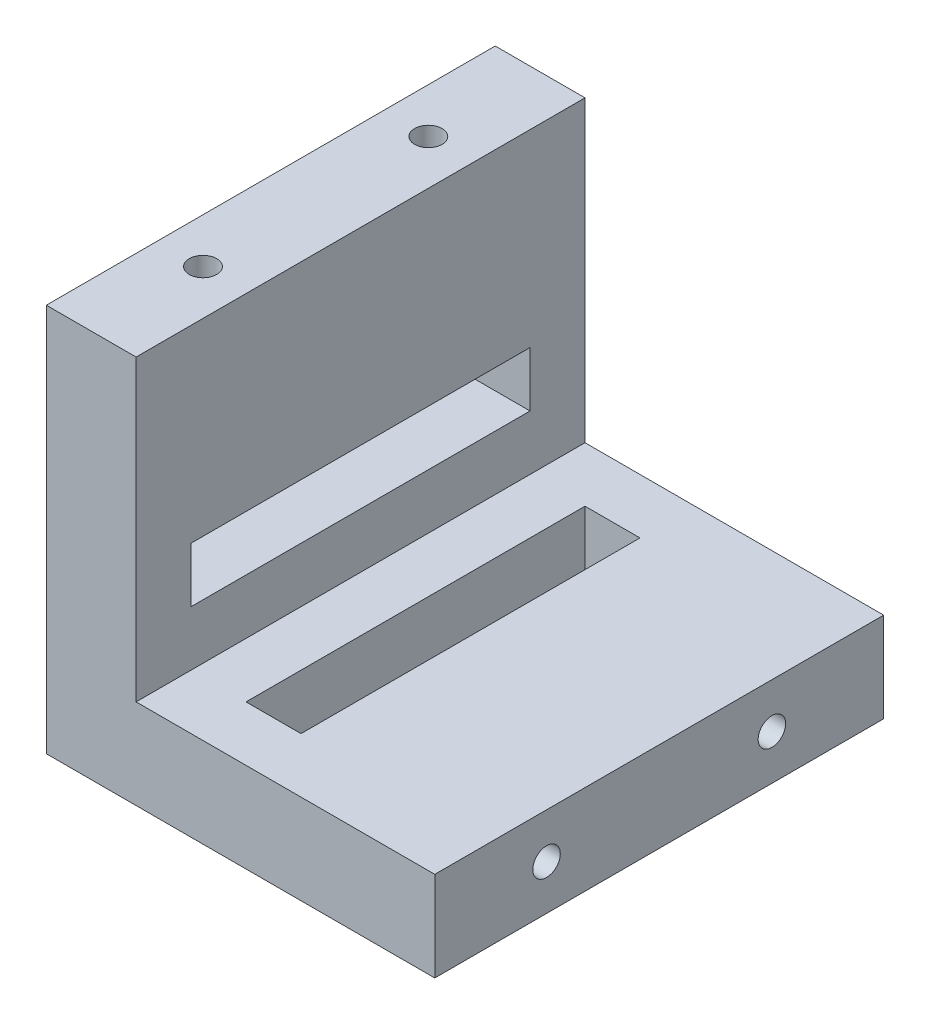
ISO-10303-21;
HEADER;
FILE_DESCRIPTION(('STEP AP214'),'2;1');
FILE_NAME('part.step','',(''),(''),'','','');
FILE_SCHEMA(('AUTOMOTIVE_DESIGN { 1 0 10303 214 1 1 1 1 }'));
ENDSEC;
DATA;
#1=APPLICATION_CONTEXT('core data for automotive mechanical design processes');
#2=APPLICATION_PROTOCOL_DEFINITION('international standard','automotive_design',2000,#1);
#3=PRODUCT_CONTEXT('',#1,'mechanical');
#4=PRODUCT('Part','Part','',(#3));
#5=PRODUCT_RELATED_PRODUCT_CATEGORY('part','',(#4));
#6=PRODUCT_DEFINITION_FORMATION('','',#4);
#7=PRODUCT_DEFINITION_CONTEXT('part definition',#1,'design');
#8=PRODUCT_DEFINITION('design','',#6,#7);
#9=PRODUCT_DEFINITION_SHAPE('','',#8);
#10=(LENGTH_UNIT() NAMED_UNIT(*) SI_UNIT(.MILLI.,.METRE.));
#11=(NAMED_UNIT(*) PLANE_ANGLE_UNIT() SI_UNIT($,.RADIAN.));
#12=(NAMED_UNIT(*) SI_UNIT($,.STERADIAN.) SOLID_ANGLE_UNIT());
#13=UNCERTAINTY_MEASURE_WITH_UNIT(LENGTH_MEASURE(1.E-05),#10,'distance_accuracy_value','');
#14=(GEOMETRIC_REPRESENTATION_CONTEXT(3) GLOBAL_UNCERTAINTY_ASSIGNED_CONTEXT((#13)) GLOBAL_UNIT_ASSIGNED_CONTEXT((#10,
#11,#12)) REPRESENTATION_CONTEXT('',''));
#15=CARTESIAN_POINT('',(0.,0.,0.));
#16=DIRECTION('',(0.,0.,1.));
#17=DIRECTION('',(1.,0.,0.));
#18=AXIS2_PLACEMENT_3D('',#15,#16,#17);
#19=CARTESIAN_POINT('',(21.2,0.,24.5));
#20=DIRECTION('',(0.,1.,0.));
#21=DIRECTION('',(-1.,0.,0.));
#22=AXIS2_PLACEMENT_3D('',#19,#20,#21);
#23=PLANE('',#22);
#24=DIRECTION('',(1.,0.,0.));
#25=VECTOR('',#24,1.);
#26=CARTESIAN_POINT('',(21.2,0.,21.5));
#27=LINE('',#26,#25);
#28=CARTESIAN_POINT('',(7.9,0.,21.5));
#29=VERTEX_POINT('',#28);
#30=CARTESIAN_POINT('',(10.9,0.,21.5));
#31=VERTEX_POINT('',#30);
#32=EDGE_CURVE('E186',#29,#31,#27,.T.);
#33=ORIENTED_EDGE('',*,*,#32,.T.);
#34=DIRECTION('',(0.,0.,-1.));
#35=VECTOR('',#34,1.);
#36=CARTESIAN_POINT('',(10.9,0.,24.5));
#37=LINE('',#36,#35);
#38=CARTESIAN_POINT('',(10.9,0.,3.));
#39=VERTEX_POINT('',#38);
#40=EDGE_CURVE('E189',#31,#39,#37,.T.);
#41=ORIENTED_EDGE('',*,*,#40,.T.);
#42=DIRECTION('',(-1.,0.,0.));
#43=VECTOR('',#42,1.);
#44=CARTESIAN_POINT('',(21.2,0.,3.));
#45=LINE('',#44,#43);
#46=CARTESIAN_POINT('',(7.9,0.,3.));
#47=VERTEX_POINT('',#46);
#48=EDGE_CURVE('E174',#39,#47,#45,.T.);
#49=ORIENTED_EDGE('',*,*,#48,.T.);
#50=DIRECTION('',(0.,0.,1.));
#51=VECTOR('',#50,1.);
#52=CARTESIAN_POINT('',(7.9,0.,24.5));
#53=LINE('',#52,#51);
#54=EDGE_CURVE('E183',#47,#29,#53,.T.);
#55=ORIENTED_EDGE('',*,*,#54,.T.);
#56=EDGE_LOOP('',(#33,#41,#49,#55));
#57=FACE_BOUND('',#56,.T.);
#58=DIRECTION('',(1.,0.,0.));
#59=VECTOR('',#58,1.);
#60=CARTESIAN_POINT('',(21.2,0.,0.));
#61=LINE('',#60,#59);
#62=CARTESIAN_POINT('',(0.,0.,0.));
#63=VERTEX_POINT('',#62);
#64=CARTESIAN_POINT('',(21.2,0.,0.));
#65=VERTEX_POINT('',#64);
#66=EDGE_CURVE('E214',#63,#65,#61,.T.);
#67=ORIENTED_EDGE('',*,*,#66,.T.);
#68=DIRECTION('',(0.,0.,-1.));
#69=VECTOR('',#68,1.);
#70=CARTESIAN_POINT('',(21.2,0.,24.5));
#71=LINE('',#70,#69);
#72=CARTESIAN_POINT('',(21.2,0.,24.5));
#73=VERTEX_POINT('',#72);
#74=EDGE_CURVE('E257',#73,#65,#71,.T.);
#75=ORIENTED_EDGE('',*,*,#74,.F.);
#76=DIRECTION('',(1.,0.,0.));
#77=VECTOR('',#76,1.);
#78=CARTESIAN_POINT('',(21.2,0.,24.5));
#79=LINE('',#78,#77);
#80=CARTESIAN_POINT('',(0.,0.,24.5));
#81=VERTEX_POINT('',#80);
#82=EDGE_CURVE('E217',#81,#73,#79,.T.);
#83=ORIENTED_EDGE('',*,*,#82,.F.);
#84=DIRECTION('',(0.,0.,-1.));
#85=VECTOR('',#84,1.);
#86=CARTESIAN_POINT('',(0.,0.,24.5));
#87=LINE('',#86,#85);
#88=EDGE_CURVE('E231',#81,#63,#87,.T.);
#89=ORIENTED_EDGE('',*,*,#88,.T.);
#90=EDGE_LOOP('',(#67,#75,#83,#89));
#91=FACE_BOUND('',#90,.T.);
#92=ADVANCED_FACE('F32',(#57,#91),#23,.F.);
#93=CARTESIAN_POINT('',(21.2,4.9,24.5));
#94=DIRECTION('',(-1.,0.,0.));
#95=DIRECTION('',(0.,-1.,0.));
#96=AXIS2_PLACEMENT_3D('',#93,#94,#95);
#97=PLANE('',#96);
#98=CARTESIAN_POINT('',(21.2,2.45,18.4));
#99=DIRECTION('',(1.,0.,0.));
#100=DIRECTION('',(0.,1.,0.));
#101=AXIS2_PLACEMENT_3D('',#98,#99,#100);
#102=CIRCLE('',#101,0.750000000000002);
#103=CARTESIAN_POINT('',(21.2,3.2,18.4));
#104=VERTEX_POINT('',#103);
#105=EDGE_CURVE('E202',#104,#104,#102,.T.);
#106=ORIENTED_EDGE('',*,*,#105,.F.);
#107=EDGE_LOOP('',(#106));
#108=FACE_BOUND('',#107,.T.);
#109=CARTESIAN_POINT('',(21.2,2.45,6.1));
#110=DIRECTION('',(1.,0.,0.));
#111=DIRECTION('',(0.,1.,0.));
#112=AXIS2_PLACEMENT_3D('',#109,#110,#111);
#113=CIRCLE('',#112,0.75);
#114=CARTESIAN_POINT('',(21.2,3.2,6.1));
#115=VERTEX_POINT('',#114);
#116=EDGE_CURVE('E208',#115,#115,#113,.T.);
#117=ORIENTED_EDGE('',*,*,#116,.F.);
#118=EDGE_LOOP('',(#117));
#119=FACE_BOUND('',#118,.T.);
#120=DIRECTION('',(0.,1.,0.));
#121=VECTOR('',#120,1.);
#122=CARTESIAN_POINT('',(21.2,4.9,0.));
#123=LINE('',#122,#121);
#124=CARTESIAN_POINT('',(21.2,4.9,0.));
#125=VERTEX_POINT('',#124);
#126=EDGE_CURVE('E234',#65,#125,#123,.T.);
#127=ORIENTED_EDGE('',*,*,#126,.T.);
#128=DIRECTION('',(0.,0.,-1.));
#129=VECTOR('',#128,1.);
#130=CARTESIAN_POINT('',(21.2,4.9,24.5));
#131=LINE('',#130,#129);
#132=CARTESIAN_POINT('',(21.2,4.9,24.5));
#133=VERTEX_POINT('',#132);
#134=EDGE_CURVE('E254',#133,#125,#131,.T.);
#135=ORIENTED_EDGE('',*,*,#134,.F.);
#136=DIRECTION('',(0.,1.,0.));
#137=VECTOR('',#136,1.);
#138=CARTESIAN_POINT('',(21.2,4.9,24.5));
#139=LINE('',#138,#137);
#140=EDGE_CURVE('E220',#73,#133,#139,.T.);
#141=ORIENTED_EDGE('',*,*,#140,.F.);
#142=ORIENTED_EDGE('',*,*,#74,.T.);
#143=EDGE_LOOP('',(#127,#135,#141,#142));
#144=FACE_BOUND('',#143,.T.);
#145=ADVANCED_FACE('F284',(#108,#119,#144),#97,.F.);
#146=CARTESIAN_POINT('',(4.9,4.90000000000001,24.5));
#147=DIRECTION('',(0.,-1.,0.));
#148=DIRECTION('',(1.,0.,0.));
#149=AXIS2_PLACEMENT_3D('',#146,#147,#148);
#150=PLANE('',#149);
#151=DIRECTION('',(-1.,0.,0.));
#152=VECTOR('',#151,1.);
#153=CARTESIAN_POINT('',(7.9,4.90000000000001,3.));
#154=LINE('',#153,#152);
#155=CARTESIAN_POINT('',(10.9,4.9,3.));
#156=VERTEX_POINT('',#155);
#157=CARTESIAN_POINT('',(7.9,4.90000000000001,3.));
#158=VERTEX_POINT('',#157);
#159=EDGE_CURVE('E162',#156,#158,#154,.T.);
#160=ORIENTED_EDGE('',*,*,#159,.F.);
#161=DIRECTION('',(0.,0.,-1.));
#162=VECTOR('',#161,1.);
#163=CARTESIAN_POINT('',(10.9,4.90000000000001,3.));
#164=LINE('',#163,#162);
#165=CARTESIAN_POINT('',(10.9,4.90000000000001,21.5));
#166=VERTEX_POINT('',#165);
#167=EDGE_CURVE('E158',#166,#156,#164,.T.);
#168=ORIENTED_EDGE('',*,*,#167,.F.);
#169=DIRECTION('',(1.,0.,0.));
#170=VECTOR('',#169,1.);
#171=CARTESIAN_POINT('',(7.9,4.90000000000001,21.5));
#172=LINE('',#171,#170);
#173=CARTESIAN_POINT('',(7.9,4.90000000000001,21.5));
#174=VERTEX_POINT('',#173);
#175=EDGE_CURVE('E168',#174,#166,#172,.T.);
#176=ORIENTED_EDGE('',*,*,#175,.F.);
#177=DIRECTION('',(0.,0.,1.));
#178=VECTOR('',#177,1.);
#179=CARTESIAN_POINT('',(7.9,4.90000000000001,3.));
#180=LINE('',#179,#178);
#181=EDGE_CURVE('E165',#158,#174,#180,.T.);
#182=ORIENTED_EDGE('',*,*,#181,.F.);
#183=EDGE_LOOP('',(#160,#168,#176,#182));
#184=FACE_BOUND('',#183,.T.);
#185=DIRECTION('',(-1.,0.,0.));
#186=VECTOR('',#185,1.);
#187=CARTESIAN_POINT('',(4.9,4.90000000000001,0.));
#188=LINE('',#187,#186);
#189=CARTESIAN_POINT('',(4.9,4.90000000000001,0.));
#190=VERTEX_POINT('',#189);
#191=EDGE_CURVE('E236',#125,#190,#188,.T.);
#192=ORIENTED_EDGE('',*,*,#191,.T.);
#193=DIRECTION('',(0.,0.,-1.));
#194=VECTOR('',#193,1.);
#195=CARTESIAN_POINT('',(4.9,4.90000000000001,24.5));
#196=LINE('',#195,#194);
#197=CARTESIAN_POINT('',(4.9,4.90000000000001,24.5));
#198=VERTEX_POINT('',#197);
#199=EDGE_CURVE('E251',#198,#190,#196,.T.);
#200=ORIENTED_EDGE('',*,*,#199,.F.);
#201=DIRECTION('',(-1.,0.,0.));
#202=VECTOR('',#201,1.);
#203=CARTESIAN_POINT('',(4.9,4.90000000000001,24.5));
#204=LINE('',#203,#202);
#205=EDGE_CURVE('E223',#133,#198,#204,.T.);
#206=ORIENTED_EDGE('',*,*,#205,.F.);
#207=ORIENTED_EDGE('',*,*,#134,.T.);
#208=EDGE_LOOP('',(#192,#200,#206,#207));
#209=FACE_BOUND('',#208,.T.);
#210=ADVANCED_FACE('F289',(#184,#209),#150,.F.);
#211=CARTESIAN_POINT('',(4.9,21.2,24.5));
#212=DIRECTION('',(-1.,0.,0.));
#213=DIRECTION('',(0.,-1.,0.));
#214=AXIS2_PLACEMENT_3D('',#211,#212,#213);
#215=PLANE('',#214);
#216=DIRECTION('',(0.,0.,-1.));
#217=VECTOR('',#216,1.);
#218=CARTESIAN_POINT('',(4.9,7.9,3.));
#219=LINE('',#218,#217);
#220=CARTESIAN_POINT('',(4.9,7.9,21.5));
#221=VERTEX_POINT('',#220);
#222=CARTESIAN_POINT('',(4.9,7.9,3.));
#223=VERTEX_POINT('',#222);
#224=EDGE_CURVE('E144',#221,#223,#219,.T.);
#225=ORIENTED_EDGE('',*,*,#224,.F.);
#226=DIRECTION('',(0.,-1.,0.));
#227=VECTOR('',#226,1.);
#228=CARTESIAN_POINT('',(4.9,10.9,21.5));
#229=LINE('',#228,#227);
#230=CARTESIAN_POINT('',(4.9,10.9,21.5));
#231=VERTEX_POINT('',#230);
#232=EDGE_CURVE('E46',#231,#221,#229,.T.);
#233=ORIENTED_EDGE('',*,*,#232,.F.);
#234=DIRECTION('',(0.,0.,1.));
#235=VECTOR('',#234,1.);
#236=CARTESIAN_POINT('',(4.9,10.9,3.));
#237=LINE('',#236,#235);
#238=CARTESIAN_POINT('',(4.9,10.9,3.));
#239=VERTEX_POINT('',#238);
#240=EDGE_CURVE('E151',#239,#231,#237,.T.);
#241=ORIENTED_EDGE('',*,*,#240,.F.);
#242=DIRECTION('',(0.,1.,0.));
#243=VECTOR('',#242,1.);
#244=CARTESIAN_POINT('',(4.9,10.9,3.));
#245=LINE('',#244,#243);
#246=EDGE_CURVE('E135',#223,#239,#245,.T.);
#247=ORIENTED_EDGE('',*,*,#246,.F.);
#248=EDGE_LOOP('',(#225,#233,#241,#247));
#249=FACE_BOUND('',#248,.T.);
#250=DIRECTION('',(0.,1.,0.));
#251=VECTOR('',#250,1.);
#252=CARTESIAN_POINT('',(4.9,21.2,0.));
#253=LINE('',#252,#251);
#254=CARTESIAN_POINT('',(4.9,21.2,0.));
#255=VERTEX_POINT('',#254);
#256=EDGE_CURVE('E238',#190,#255,#253,.T.);
#257=ORIENTED_EDGE('',*,*,#256,.T.);
#258=DIRECTION('',(0.,0.,-1.));
#259=VECTOR('',#258,1.);
#260=CARTESIAN_POINT('',(4.9,21.2,24.5));
#261=LINE('',#260,#259);
#262=CARTESIAN_POINT('',(4.9,21.2,24.5));
#263=VERTEX_POINT('',#262);
#264=EDGE_CURVE('E248',#263,#255,#261,.T.);
#265=ORIENTED_EDGE('',*,*,#264,.F.);
#266=DIRECTION('',(0.,1.,0.));
#267=VECTOR('',#266,1.);
#268=CARTESIAN_POINT('',(4.9,21.2,24.5));
#269=LINE('',#268,#267);
#270=EDGE_CURVE('E225',#198,#263,#269,.T.);
#271=ORIENTED_EDGE('',*,*,#270,.F.);
#272=ORIENTED_EDGE('',*,*,#199,.T.);
#273=EDGE_LOOP('',(#257,#265,#271,#272));
#274=FACE_BOUND('',#273,.T.);
#275=ADVANCED_FACE('F148',(#249,#274),#215,.F.);
#276=CARTESIAN_POINT('',(0.,21.2,24.5));
#277=DIRECTION('',(0.,-1.,0.));
#278=DIRECTION('',(1.,0.,0.));
#279=AXIS2_PLACEMENT_3D('',#276,#277,#278);
#280=PLANE('',#279);
#281=CARTESIAN_POINT('',(2.45,21.2,18.4));
#282=DIRECTION('',(0.,1.,0.));
#283=DIRECTION('',(-1.,0.,0.));
#284=AXIS2_PLACEMENT_3D('',#281,#282,#283);
#285=CIRCLE('',#284,0.75);
#286=CARTESIAN_POINT('',(1.7,21.2,18.4));
#287=VERTEX_POINT('',#286);
#288=EDGE_CURVE('E192',#287,#287,#285,.T.);
#289=ORIENTED_EDGE('',*,*,#288,.F.);
#290=EDGE_LOOP('',(#289));
#291=FACE_BOUND('',#290,.T.);
#292=CARTESIAN_POINT('',(2.45,21.2,6.1));
#293=DIRECTION('',(0.,1.,0.));
#294=DIRECTION('',(-1.,0.,0.));
#295=AXIS2_PLACEMENT_3D('',#292,#293,#294);
#296=CIRCLE('',#295,0.75);
#297=CARTESIAN_POINT('',(1.7,21.2,6.1));
#298=VERTEX_POINT('',#297);
#299=EDGE_CURVE('E196',#298,#298,#296,.T.);
#300=ORIENTED_EDGE('',*,*,#299,.F.);
#301=EDGE_LOOP('',(#300));
#302=FACE_BOUND('',#301,.T.);
#303=DIRECTION('',(-1.,0.,0.));
#304=VECTOR('',#303,1.);
#305=CARTESIAN_POINT('',(0.,21.2,0.));
#306=LINE('',#305,#304);
#307=CARTESIAN_POINT('',(0.,21.2,0.));
#308=VERTEX_POINT('',#307);
#309=EDGE_CURVE('E240',#255,#308,#306,.T.);
#310=ORIENTED_EDGE('',*,*,#309,.T.);
#311=DIRECTION('',(0.,0.,-1.));
#312=VECTOR('',#311,1.);
#313=CARTESIAN_POINT('',(0.,21.2,24.5));
#314=LINE('',#313,#312);
#315=CARTESIAN_POINT('',(0.,21.2,24.5));
#316=VERTEX_POINT('',#315);
#317=EDGE_CURVE('E245',#316,#308,#314,.T.);
#318=ORIENTED_EDGE('',*,*,#317,.F.);
#319=DIRECTION('',(-1.,0.,0.));
#320=VECTOR('',#319,1.);
#321=CARTESIAN_POINT('',(0.,21.2,24.5));
#322=LINE('',#321,#320);
#323=EDGE_CURVE('E227',#263,#316,#322,.T.);
#324=ORIENTED_EDGE('',*,*,#323,.F.);
#325=ORIENTED_EDGE('',*,*,#264,.T.);
#326=EDGE_LOOP('',(#310,#318,#324,#325));
#327=FACE_BOUND('',#326,.T.);
#328=ADVANCED_FACE('F311',(#291,#302,#327),#280,.F.);
#329=CARTESIAN_POINT('',(0.,0.,24.5));
#330=DIRECTION('',(1.,0.,0.));
#331=DIRECTION('',(0.,0.,-1.));
#332=AXIS2_PLACEMENT_3D('',#329,#330,#331);
#333=PLANE('',#332);
#334=DIRECTION('',(0.,0.,1.));
#335=VECTOR('',#334,1.);
#336=CARTESIAN_POINT('',(0.,10.9,24.5));
#337=LINE('',#336,#335);
#338=CARTESIAN_POINT('',(0.,10.9,3.));
#339=VERTEX_POINT('',#338);
#340=CARTESIAN_POINT('',(0.,10.9,21.5));
#341=VERTEX_POINT('',#340);
#342=EDGE_CURVE('E39',#339,#341,#337,.T.);
#343=ORIENTED_EDGE('',*,*,#342,.T.);
#344=DIRECTION('',(0.,-1.,0.));
#345=VECTOR('',#344,1.);
#346=CARTESIAN_POINT('',(0.,0.,21.5));
#347=LINE('',#346,#345);
#348=CARTESIAN_POINT('',(0.,7.9,21.5));
#349=VERTEX_POINT('',#348);
#350=EDGE_CURVE('E11',#341,#349,#347,.T.);
#351=ORIENTED_EDGE('',*,*,#350,.T.);
#352=DIRECTION('',(0.,0.,-1.));
#353=VECTOR('',#352,1.);
#354=CARTESIAN_POINT('',(0.,7.9,24.5));
#355=LINE('',#354,#353);
#356=CARTESIAN_POINT('',(0.,7.9,3.));
#357=VERTEX_POINT('',#356);
#358=EDGE_CURVE('E260',#349,#357,#355,.T.);
#359=ORIENTED_EDGE('',*,*,#358,.T.);
#360=DIRECTION('',(0.,1.,0.));
#361=VECTOR('',#360,1.);
#362=CARTESIAN_POINT('',(0.,0.,3.));
#363=LINE('',#362,#361);
#364=EDGE_CURVE('E138',#357,#339,#363,.T.);
#365=ORIENTED_EDGE('',*,*,#364,.T.);
#366=EDGE_LOOP('',(#343,#351,#359,#365));
#367=FACE_BOUND('',#366,.T.);
#368=DIRECTION('',(0.,-1.,0.));
#369=VECTOR('',#368,1.);
#370=CARTESIAN_POINT('',(0.,0.,0.));
#371=LINE('',#370,#369);
#372=EDGE_CURVE('E221',#308,#63,#371,.T.);
#373=ORIENTED_EDGE('',*,*,#372,.T.);
#374=ORIENTED_EDGE('',*,*,#88,.F.);
#375=DIRECTION('',(0.,-1.,0.));
#376=VECTOR('',#375,1.);
#377=CARTESIAN_POINT('',(0.,0.,24.5));
#378=LINE('',#377,#376);
#379=EDGE_CURVE('E229',#316,#81,#378,.T.);
#380=ORIENTED_EDGE('',*,*,#379,.F.);
#381=ORIENTED_EDGE('',*,*,#317,.T.);
#382=EDGE_LOOP('',(#373,#374,#380,#381));
#383=FACE_BOUND('',#382,.T.);
#384=ADVANCED_FACE('F264',(#367,#383),#333,.F.);
#385=CARTESIAN_POINT('',(0.,0.,24.5));
#386=DIRECTION('',(0.,0.,-1.));
#387=DIRECTION('',(-1.,0.,0.));
#388=AXIS2_PLACEMENT_3D('',#385,#386,#387);
#389=PLANE('',#388);
#390=ORIENTED_EDGE('',*,*,#82,.T.);
#391=ORIENTED_EDGE('',*,*,#140,.T.);
#392=ORIENTED_EDGE('',*,*,#205,.T.);
#393=ORIENTED_EDGE('',*,*,#270,.T.);
#394=ORIENTED_EDGE('',*,*,#323,.T.);
#395=ORIENTED_EDGE('',*,*,#379,.T.);
#396=EDGE_LOOP('',(#390,#391,#392,#393,#394,#395));
#397=FACE_BOUND('',#396,.T.);
#398=ADVANCED_FACE('F306',(#397),#389,.F.);
#399=CARTESIAN_POINT('',(0.,0.,0.));
#400=DIRECTION('',(0.,0.,-1.));
#401=DIRECTION('',(-1.,0.,0.));
#402=AXIS2_PLACEMENT_3D('',#399,#400,#401);
#403=PLANE('',#402);
#404=ORIENTED_EDGE('',*,*,#66,.F.);
#405=ORIENTED_EDGE('',*,*,#372,.F.);
#406=ORIENTED_EDGE('',*,*,#309,.F.);
#407=ORIENTED_EDGE('',*,*,#256,.F.);
#408=ORIENTED_EDGE('',*,*,#191,.F.);
#409=ORIENTED_EDGE('',*,*,#126,.F.);
#410=EDGE_LOOP('',(#404,#405,#406,#407,#408,#409));
#411=FACE_BOUND('',#410,.T.);
#412=ADVANCED_FACE('F298',(#411),#403,.T.);
#413=CARTESIAN_POINT('',(16.2,2.45,6.1));
#414=DIRECTION('',(1.,0.,0.));
#415=DIRECTION('',(0.,1.,0.));
#416=AXIS2_PLACEMENT_3D('',#413,#414,#415);
#417=CYLINDRICAL_SURFACE('',#416,0.75);
#418=CARTESIAN_POINT('',(16.2,2.45,6.1));
#419=DIRECTION('',(1.,0.,0.));
#420=DIRECTION('',(0.,1.,0.));
#421=AXIS2_PLACEMENT_3D('',#418,#419,#420);
#422=CIRCLE('',#421,0.75);
#423=CARTESIAN_POINT('',(16.2,3.2,6.1));
#424=VERTEX_POINT('',#423);
#425=EDGE_CURVE('E211',#424,#424,#422,.T.);
#426=ORIENTED_EDGE('',*,*,#425,.F.);
#427=EDGE_LOOP('',(#426));
#428=FACE_BOUND('',#427,.T.);
#429=ORIENTED_EDGE('',*,*,#116,.T.);
#430=EDGE_LOOP('',(#429));
#431=FACE_BOUND('',#430,.T.);
#432=ADVANCED_FACE('F332',(#428,#431),#417,.F.);
#433=CARTESIAN_POINT('',(16.2,2.45,6.1));
#434=DIRECTION('',(1.,0.,0.));
#435=DIRECTION('',(0.,1.,0.));
#436=AXIS2_PLACEMENT_3D('',#433,#434,#435);
#437=PLANE('',#436);
#438=ORIENTED_EDGE('',*,*,#425,.T.);
#439=EDGE_LOOP('',(#438));
#440=FACE_BOUND('',#439,.T.);
#441=ADVANCED_FACE('F337',(#440),#437,.T.);
#442=CARTESIAN_POINT('',(16.2,2.45,18.4));
#443=DIRECTION('',(1.,0.,0.));
#444=DIRECTION('',(0.,1.,0.));
#445=AXIS2_PLACEMENT_3D('',#442,#443,#444);
#446=CYLINDRICAL_SURFACE('',#445,0.750000000000002);
#447=CARTESIAN_POINT('',(16.2,2.45,18.4));
#448=DIRECTION('',(1.,0.,0.));
#449=DIRECTION('',(0.,1.,0.));
#450=AXIS2_PLACEMENT_3D('',#447,#448,#449);
#451=CIRCLE('',#450,0.750000000000002);
#452=CARTESIAN_POINT('',(16.2,3.2,18.4));
#453=VERTEX_POINT('',#452);
#454=EDGE_CURVE('E205',#453,#453,#451,.T.);
#455=ORIENTED_EDGE('',*,*,#454,.F.);
#456=EDGE_LOOP('',(#455));
#457=FACE_BOUND('',#456,.T.);
#458=ORIENTED_EDGE('',*,*,#105,.T.);
#459=EDGE_LOOP('',(#458));
#460=FACE_BOUND('',#459,.T.);
#461=ADVANCED_FACE('F341',(#457,#460),#446,.F.);
#462=CARTESIAN_POINT('',(16.2,2.45,18.4));
#463=DIRECTION('',(1.,0.,0.));
#464=DIRECTION('',(0.,1.,0.));
#465=AXIS2_PLACEMENT_3D('',#462,#463,#464);
#466=PLANE('',#465);
#467=ORIENTED_EDGE('',*,*,#454,.T.);
#468=EDGE_LOOP('',(#467));
#469=FACE_BOUND('',#468,.T.);
#470=ADVANCED_FACE('F345',(#469),#466,.T.);
#471=CARTESIAN_POINT('',(2.45,16.2,6.1));
#472=DIRECTION('',(0.,1.,0.));
#473=DIRECTION('',(-1.,0.,0.));
#474=AXIS2_PLACEMENT_3D('',#471,#472,#473);
#475=CYLINDRICAL_SURFACE('',#474,0.75);
#476=CARTESIAN_POINT('',(2.45,16.2,6.1));
#477=DIRECTION('',(0.,1.,0.));
#478=DIRECTION('',(-1.,0.,0.));
#479=AXIS2_PLACEMENT_3D('',#476,#477,#478);
#480=CIRCLE('',#479,0.75);
#481=CARTESIAN_POINT('',(1.7,16.2,6.1));
#482=VERTEX_POINT('',#481);
#483=EDGE_CURVE('E199',#482,#482,#480,.T.);
#484=ORIENTED_EDGE('',*,*,#483,.F.);
#485=EDGE_LOOP('',(#484));
#486=FACE_BOUND('',#485,.T.);
#487=ORIENTED_EDGE('',*,*,#299,.T.);
#488=EDGE_LOOP('',(#487));
#489=FACE_BOUND('',#488,.T.);
#490=ADVANCED_FACE('F349',(#486,#489),#475,.F.);
#491=CARTESIAN_POINT('',(2.45,16.2,6.1));
#492=DIRECTION('',(0.,1.,0.));
#493=DIRECTION('',(-1.,0.,0.));
#494=AXIS2_PLACEMENT_3D('',#491,#492,#493);
#495=PLANE('',#494);
#496=ORIENTED_EDGE('',*,*,#483,.T.);
#497=EDGE_LOOP('',(#496));
#498=FACE_BOUND('',#497,.T.);
#499=ADVANCED_FACE('F353',(#498),#495,.T.);
#500=CARTESIAN_POINT('',(2.45,16.2,18.4));
#501=DIRECTION('',(0.,1.,0.));
#502=DIRECTION('',(-1.,0.,0.));
#503=AXIS2_PLACEMENT_3D('',#500,#501,#502);
#504=CYLINDRICAL_SURFACE('',#503,0.75);
#505=CARTESIAN_POINT('',(2.45,16.2,18.4));
#506=DIRECTION('',(0.,1.,0.));
#507=DIRECTION('',(-1.,0.,0.));
#508=AXIS2_PLACEMENT_3D('',#505,#506,#507);
#509=CIRCLE('',#508,0.75);
#510=CARTESIAN_POINT('',(1.7,16.2,18.4));
#511=VERTEX_POINT('',#510);
#512=EDGE_CURVE('E193',#511,#511,#509,.T.);
#513=ORIENTED_EDGE('',*,*,#512,.F.);
#514=EDGE_LOOP('',(#513));
#515=FACE_BOUND('',#514,.T.);
#516=ORIENTED_EDGE('',*,*,#288,.T.);
#517=EDGE_LOOP('',(#516));
#518=FACE_BOUND('',#517,.T.);
#519=ADVANCED_FACE('F357',(#515,#518),#504,.F.);
#520=CARTESIAN_POINT('',(2.45,16.2,18.4));
#521=DIRECTION('',(0.,1.,0.));
#522=DIRECTION('',(-1.,0.,0.));
#523=AXIS2_PLACEMENT_3D('',#520,#521,#522);
#524=PLANE('',#523);
#525=ORIENTED_EDGE('',*,*,#512,.T.);
#526=EDGE_LOOP('',(#525));
#527=FACE_BOUND('',#526,.T.);
#528=ADVANCED_FACE('F361',(#527),#524,.T.);
#529=CARTESIAN_POINT('',(10.9,-0.0999999999999942,3.));
#530=DIRECTION('',(1.,0.,0.));
#531=DIRECTION('',(0.,1.,0.));
#532=AXIS2_PLACEMENT_3D('',#529,#530,#531);
#533=PLANE('',#532);
#534=DIRECTION('',(0.,1.,0.));
#535=VECTOR('',#534,1.);
#536=CARTESIAN_POINT('',(10.9,-0.0999999999999942,21.5));
#537=LINE('',#536,#535);
#538=EDGE_CURVE('E172',#31,#166,#537,.T.);
#539=ORIENTED_EDGE('',*,*,#538,.T.);
#540=ORIENTED_EDGE('',*,*,#167,.T.);
#541=DIRECTION('',(0.,1.,0.));
#542=VECTOR('',#541,1.);
#543=CARTESIAN_POINT('',(10.9,-0.0999999999999942,3.));
#544=LINE('',#543,#542);
#545=EDGE_CURVE('E171',#39,#156,#544,.T.);
#546=ORIENTED_EDGE('',*,*,#545,.F.);
#547=ORIENTED_EDGE('',*,*,#40,.F.);
#548=EDGE_LOOP('',(#539,#540,#546,#547));
#549=FACE_BOUND('',#548,.T.);
#550=ADVANCED_FACE('F365',(#549),#533,.F.);
#551=CARTESIAN_POINT('',(7.9,-0.0999999999999942,21.5));
#552=DIRECTION('',(0.,0.,1.));
#553=DIRECTION('',(1.,0.,0.));
#554=AXIS2_PLACEMENT_3D('',#551,#552,#553);
#555=PLANE('',#554);
#556=DIRECTION('',(0.,1.,0.));
#557=VECTOR('',#556,1.);
#558=CARTESIAN_POINT('',(7.9,-0.0999999999999942,21.5));
#559=LINE('',#558,#557);
#560=EDGE_CURVE('E175',#29,#174,#559,.T.);
#561=ORIENTED_EDGE('',*,*,#560,.T.);
#562=ORIENTED_EDGE('',*,*,#175,.T.);
#563=ORIENTED_EDGE('',*,*,#538,.F.);
#564=ORIENTED_EDGE('',*,*,#32,.F.);
#565=EDGE_LOOP('',(#561,#562,#563,#564));
#566=FACE_BOUND('',#565,.T.);
#567=ADVANCED_FACE('F368',(#566),#555,.F.);
#568=CARTESIAN_POINT('',(7.9,-0.0999999999999942,3.));
#569=DIRECTION('',(-1.,0.,0.));
#570=DIRECTION('',(0.,-1.,0.));
#571=AXIS2_PLACEMENT_3D('',#568,#569,#570);
#572=PLANE('',#571);
#573=DIRECTION('',(0.,1.,0.));
#574=VECTOR('',#573,1.);
#575=CARTESIAN_POINT('',(7.9,-0.0999999999999942,3.));
#576=LINE('',#575,#574);
#577=EDGE_CURVE('E177',#47,#158,#576,.T.);
#578=ORIENTED_EDGE('',*,*,#577,.T.);
#579=ORIENTED_EDGE('',*,*,#181,.T.);
#580=ORIENTED_EDGE('',*,*,#560,.F.);
#581=ORIENTED_EDGE('',*,*,#54,.F.);
#582=EDGE_LOOP('',(#578,#579,#580,#581));
#583=FACE_BOUND('',#582,.T.);
#584=ADVANCED_FACE('F278',(#583),#572,.F.);
#585=CARTESIAN_POINT('',(7.9,-0.0999999999999942,3.));
#586=DIRECTION('',(0.,0.,-1.));
#587=DIRECTION('',(-1.,0.,0.));
#588=AXIS2_PLACEMENT_3D('',#585,#586,#587);
#589=PLANE('',#588);
#590=ORIENTED_EDGE('',*,*,#545,.T.);
#591=ORIENTED_EDGE('',*,*,#159,.T.);
#592=ORIENTED_EDGE('',*,*,#577,.F.);
#593=ORIENTED_EDGE('',*,*,#48,.F.);
#594=EDGE_LOOP('',(#590,#591,#592,#593));
#595=FACE_BOUND('',#594,.T.);
#596=ADVANCED_FACE('F271',(#595),#589,.F.);
#597=CARTESIAN_POINT('',(-0.100000000000001,10.9,21.5));
#598=DIRECTION('',(0.,0.,1.));
#599=DIRECTION('',(1.,0.,0.));
#600=AXIS2_PLACEMENT_3D('',#597,#598,#599);
#601=PLANE('',#600);
#602=DIRECTION('',(1.,0.,0.));
#603=VECTOR('',#602,1.);
#604=CARTESIAN_POINT('',(-0.100000000000001,10.9,21.5));
#605=LINE('',#604,#603);
#606=EDGE_CURVE('E156',#341,#231,#605,.T.);
#607=ORIENTED_EDGE('',*,*,#606,.T.);
#608=ORIENTED_EDGE('',*,*,#232,.T.);
#609=DIRECTION('',(1.,0.,0.));
#610=VECTOR('',#609,1.);
#611=CARTESIAN_POINT('',(-0.100000000000001,7.9,21.5));
#612=LINE('',#611,#610);
#613=EDGE_CURVE('E141',#349,#221,#612,.T.);
#614=ORIENTED_EDGE('',*,*,#613,.F.);
#615=ORIENTED_EDGE('',*,*,#350,.F.);
#616=EDGE_LOOP('',(#607,#608,#614,#615));
#617=FACE_BOUND('',#616,.T.);
#618=ADVANCED_FACE('F269',(#617),#601,.F.);
#619=CARTESIAN_POINT('',(-0.100000000000001,10.9,3.));
#620=DIRECTION('',(0.,1.,0.));
#621=DIRECTION('',(-1.,0.,0.));
#622=AXIS2_PLACEMENT_3D('',#619,#620,#621);
#623=PLANE('',#622);
#624=DIRECTION('',(1.,0.,0.));
#625=VECTOR('',#624,1.);
#626=CARTESIAN_POINT('',(-0.100000000000001,10.9,3.));
#627=LINE('',#626,#625);
#628=EDGE_CURVE('E140',#339,#239,#627,.T.);
#629=ORIENTED_EDGE('',*,*,#628,.T.);
#630=ORIENTED_EDGE('',*,*,#240,.T.);
#631=ORIENTED_EDGE('',*,*,#606,.F.);
#632=ORIENTED_EDGE('',*,*,#342,.F.);
#633=EDGE_LOOP('',(#629,#630,#631,#632));
#634=FACE_BOUND('',#633,.T.);
#635=ADVANCED_FACE('F268',(#634),#623,.F.);
#636=CARTESIAN_POINT('',(-0.100000000000001,10.9,3.));
#637=DIRECTION('',(0.,0.,-1.));
#638=DIRECTION('',(0.,1.,0.));
#639=AXIS2_PLACEMENT_3D('',#636,#637,#638);
#640=PLANE('',#639);
#641=DIRECTION('',(1.,0.,0.));
#642=VECTOR('',#641,1.);
#643=CARTESIAN_POINT('',(-0.100000000000001,7.9,3.));
#644=LINE('',#643,#642);
#645=EDGE_CURVE('E54',#357,#223,#644,.T.);
#646=ORIENTED_EDGE('',*,*,#645,.T.);
#647=ORIENTED_EDGE('',*,*,#246,.T.);
#648=ORIENTED_EDGE('',*,*,#628,.F.);
#649=ORIENTED_EDGE('',*,*,#364,.F.);
#650=EDGE_LOOP('',(#646,#647,#648,#649));
#651=FACE_BOUND('',#650,.T.);
#652=ADVANCED_FACE('F132',(#651),#640,.F.);
#653=CARTESIAN_POINT('',(-0.100000000000001,7.9,3.));
#654=DIRECTION('',(0.,-1.,0.));
#655=DIRECTION('',(1.,0.,0.));
#656=AXIS2_PLACEMENT_3D('',#653,#654,#655);
#657=PLANE('',#656);
#658=ORIENTED_EDGE('',*,*,#613,.T.);
#659=ORIENTED_EDGE('',*,*,#224,.T.);
#660=ORIENTED_EDGE('',*,*,#645,.F.);
#661=ORIENTED_EDGE('',*,*,#358,.F.);
#662=EDGE_LOOP('',(#658,#659,#660,#661));
#663=FACE_BOUND('',#662,.T.);
#664=ADVANCED_FACE('F145',(#663),#657,.F.);
#665=CLOSED_SHELL('',(#92,#145,#210,#275,#328,#384,#398,#412,#432,#441,#461,#470,#490,#499,#519,
#528,#550,#567,#584,#596,#618,#635,#652,#664));
#666=MANIFOLD_SOLID_BREP('B2',#665);
#667=ADVANCED_BREP_SHAPE_REPRESENTATION('',(#18,#666),#14);
#668=SHAPE_DEFINITION_REPRESENTATION(#9,#667);
ENDSEC;
END-ISO-10303-21;
